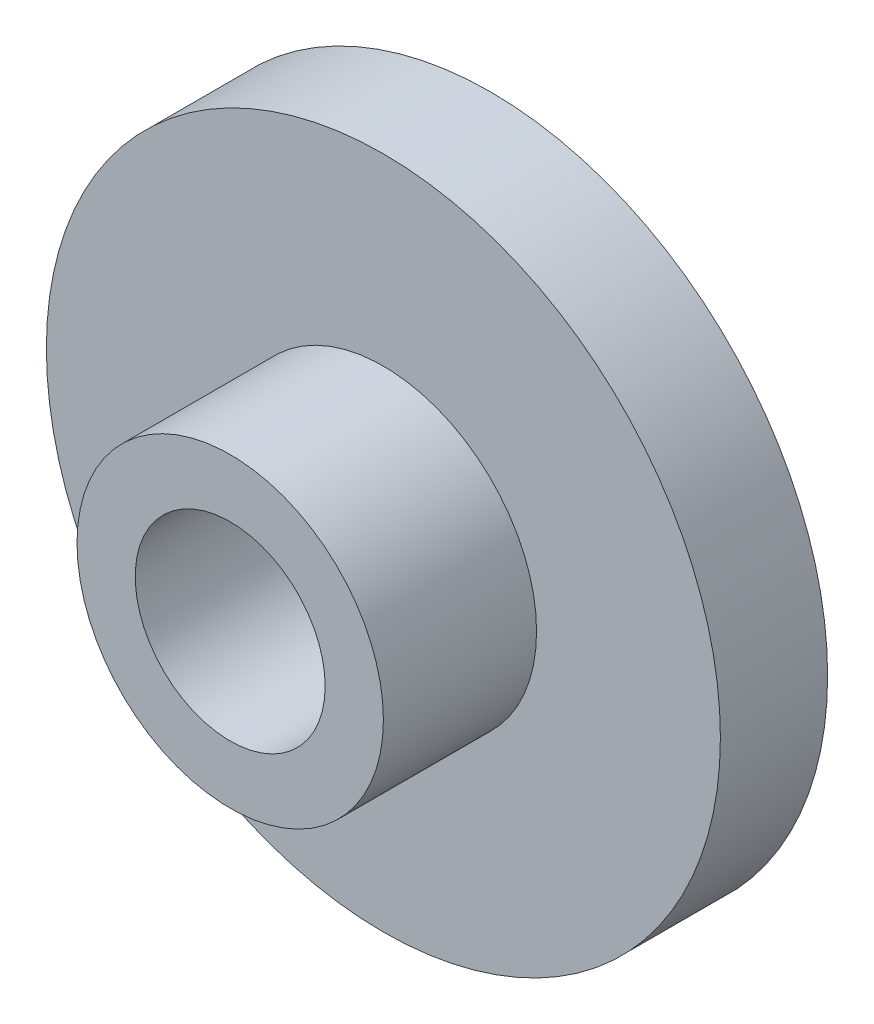
ISO-10303-21;
HEADER;
FILE_DESCRIPTION(('STEP AP214'),'2;1');
FILE_NAME('part.step','',(''),(''),'','','');
FILE_SCHEMA(('AUTOMOTIVE_DESIGN { 1 0 10303 214 1 1 1 1 }'));
ENDSEC;
DATA;
#1=APPLICATION_CONTEXT('core data for automotive mechanical design processes');
#2=APPLICATION_PROTOCOL_DEFINITION('international standard','automotive_design',2000,#1);
#3=PRODUCT_CONTEXT('',#1,'mechanical');
#4=PRODUCT('Part','Part','',(#3));
#5=PRODUCT_RELATED_PRODUCT_CATEGORY('part','',(#4));
#6=PRODUCT_DEFINITION_FORMATION('','',#4);
#7=PRODUCT_DEFINITION_CONTEXT('part definition',#1,'design');
#8=PRODUCT_DEFINITION('design','',#6,#7);
#9=PRODUCT_DEFINITION_SHAPE('','',#8);
#10=(LENGTH_UNIT() NAMED_UNIT(*) SI_UNIT(.MILLI.,.METRE.));
#11=(NAMED_UNIT(*) PLANE_ANGLE_UNIT() SI_UNIT($,.RADIAN.));
#12=(NAMED_UNIT(*) SI_UNIT($,.STERADIAN.) SOLID_ANGLE_UNIT());
#13=UNCERTAINTY_MEASURE_WITH_UNIT(LENGTH_MEASURE(1.E-05),#10,'distance_accuracy_value','');
#14=(GEOMETRIC_REPRESENTATION_CONTEXT(3) GLOBAL_UNCERTAINTY_ASSIGNED_CONTEXT((#13)) GLOBAL_UNIT_ASSIGNED_CONTEXT((#10,
#11,#12)) REPRESENTATION_CONTEXT('',''));
#15=CARTESIAN_POINT('',(0.,0.,0.));
#16=DIRECTION('',(0.,0.,1.));
#17=DIRECTION('',(1.,0.,0.));
#18=AXIS2_PLACEMENT_3D('',#15,#16,#17);
#19=CARTESIAN_POINT('',(0.,0.,3.5));
#20=DIRECTION('',(0.,0.,1.));
#21=DIRECTION('',(1.,0.,0.));
#22=AXIS2_PLACEMENT_3D('',#19,#20,#21);
#23=PLANE('',#22);
#24=CARTESIAN_POINT('',(0.,0.,3.5));
#25=DIRECTION('',(0.,0.,1.));
#26=DIRECTION('',(1.,0.,0.));
#27=AXIS2_PLACEMENT_3D('',#24,#25,#26);
#28=CIRCLE('',#27,11.);
#29=CARTESIAN_POINT('',(11.,0.,3.5));
#30=VERTEX_POINT('',#29);
#31=EDGE_CURVE('E10',#30,#30,#28,.T.);
#32=ORIENTED_EDGE('',*,*,#31,.T.);
#33=EDGE_LOOP('',(#32));
#34=FACE_BOUND('',#33,.T.);
#35=CARTESIAN_POINT('',(0.,0.,3.5));
#36=DIRECTION('',(0.,0.,1.));
#37=DIRECTION('',(1.,0.,0.));
#38=AXIS2_PLACEMENT_3D('',#35,#36,#37);
#39=CIRCLE('',#38,5.);
#40=CARTESIAN_POINT('',(5.,0.,3.5));
#41=VERTEX_POINT('',#40);
#42=EDGE_CURVE('E46',#41,#41,#39,.T.);
#43=ORIENTED_EDGE('',*,*,#42,.F.);
#44=EDGE_LOOP('',(#43));
#45=FACE_BOUND('',#44,.T.);
#46=ADVANCED_FACE('F33',(#34,#45),#23,.T.);
#47=CARTESIAN_POINT('',(0.,0.,3.5));
#48=DIRECTION('',(0.,0.,-1.));
#49=DIRECTION('',(-1.,0.,0.));
#50=AXIS2_PLACEMENT_3D('',#47,#48,#49);
#51=CYLINDRICAL_SURFACE('',#50,11.);
#52=ORIENTED_EDGE('',*,*,#31,.F.);
#53=EDGE_LOOP('',(#52));
#54=FACE_BOUND('',#53,.T.);
#55=CARTESIAN_POINT('',(0.,0.,0.));
#56=DIRECTION('',(0.,0.,1.));
#57=DIRECTION('',(1.,0.,0.));
#58=AXIS2_PLACEMENT_3D('',#55,#56,#57);
#59=CIRCLE('',#58,11.);
#60=CARTESIAN_POINT('',(11.,0.,0.));
#61=VERTEX_POINT('',#60);
#62=EDGE_CURVE('E37',#61,#61,#59,.T.);
#63=ORIENTED_EDGE('',*,*,#62,.T.);
#64=EDGE_LOOP('',(#63));
#65=FACE_BOUND('',#64,.T.);
#66=ADVANCED_FACE('F35',(#54,#65),#51,.T.);
#67=CARTESIAN_POINT('',(0.,0.,0.));
#68=DIRECTION('',(0.,0.,1.));
#69=DIRECTION('',(1.,0.,0.));
#70=AXIS2_PLACEMENT_3D('',#67,#68,#69);
#71=PLANE('',#70);
#72=CARTESIAN_POINT('',(0.,0.,0.));
#73=DIRECTION('',(0.,0.,1.));
#74=DIRECTION('',(1.,0.,0.));
#75=AXIS2_PLACEMENT_3D('',#72,#73,#74);
#76=CIRCLE('',#75,3.1);
#77=CARTESIAN_POINT('',(3.1,0.,0.));
#78=VERTEX_POINT('',#77);
#79=EDGE_CURVE('E49',#78,#78,#76,.T.);
#80=ORIENTED_EDGE('',*,*,#79,.T.);
#81=EDGE_LOOP('',(#80));
#82=FACE_BOUND('',#81,.T.);
#83=ORIENTED_EDGE('',*,*,#62,.F.);
#84=EDGE_LOOP('',(#83));
#85=FACE_BOUND('',#84,.T.);
#86=ADVANCED_FACE('F58',(#82,#85),#71,.F.);
#87=CARTESIAN_POINT('',(0.,0.,8.5));
#88=DIRECTION('',(0.,0.,-1.));
#89=DIRECTION('',(-1.,0.,0.));
#90=AXIS2_PLACEMENT_3D('',#87,#88,#89);
#91=CYLINDRICAL_SURFACE('',#90,5.);
#92=CARTESIAN_POINT('',(0.,0.,8.5));
#93=DIRECTION('',(0.,0.,1.));
#94=DIRECTION('',(1.,0.,0.));
#95=AXIS2_PLACEMENT_3D('',#92,#93,#94);
#96=CIRCLE('',#95,5.);
#97=CARTESIAN_POINT('',(5.,0.,8.5));
#98=VERTEX_POINT('',#97);
#99=EDGE_CURVE('E44',#98,#98,#96,.T.);
#100=ORIENTED_EDGE('',*,*,#99,.F.);
#101=EDGE_LOOP('',(#100));
#102=FACE_BOUND('',#101,.T.);
#103=ORIENTED_EDGE('',*,*,#42,.T.);
#104=EDGE_LOOP('',(#103));
#105=FACE_BOUND('',#104,.T.);
#106=ADVANCED_FACE('F70',(#102,#105),#91,.T.);
#107=CARTESIAN_POINT('',(0.,0.,8.5));
#108=DIRECTION('',(0.,0.,1.));
#109=DIRECTION('',(1.,0.,0.));
#110=AXIS2_PLACEMENT_3D('',#107,#108,#109);
#111=PLANE('',#110);
#112=CARTESIAN_POINT('',(0.,0.,8.5));
#113=DIRECTION('',(0.,0.,1.));
#114=DIRECTION('',(1.,0.,0.));
#115=AXIS2_PLACEMENT_3D('',#112,#113,#114);
#116=CIRCLE('',#115,3.1);
#117=CARTESIAN_POINT('',(3.1,0.,8.5));
#118=VERTEX_POINT('',#117);
#119=EDGE_CURVE('E52',#118,#118,#116,.T.);
#120=ORIENTED_EDGE('',*,*,#119,.F.);
#121=EDGE_LOOP('',(#120));
#122=FACE_BOUND('',#121,.T.);
#123=ORIENTED_EDGE('',*,*,#99,.T.);
#124=EDGE_LOOP('',(#123));
#125=FACE_BOUND('',#124,.T.);
#126=ADVANCED_FACE('F64',(#122,#125),#111,.T.);
#127=CARTESIAN_POINT('',(0.,0.,0.));
#128=DIRECTION('',(0.,0.,1.));
#129=DIRECTION('',(1.,0.,0.));
#130=AXIS2_PLACEMENT_3D('',#127,#128,#129);
#131=CYLINDRICAL_SURFACE('',#130,3.1);
#132=ORIENTED_EDGE('',*,*,#79,.F.);
#133=EDGE_LOOP('',(#132));
#134=FACE_BOUND('',#133,.T.);
#135=ORIENTED_EDGE('',*,*,#119,.T.);
#136=EDGE_LOOP('',(#135));
#137=FACE_BOUND('',#136,.T.);
#138=ADVANCED_FACE('F61',(#134,#137),#131,.F.);
#139=CLOSED_SHELL('',(#46,#66,#86,#106,#126,#138));
#140=MANIFOLD_SOLID_BREP('B2',#139);
#141=ADVANCED_BREP_SHAPE_REPRESENTATION('',(#18,#140),#14);
#142=SHAPE_DEFINITION_REPRESENTATION(#9,#141);
ENDSEC;
END-ISO-10303-21;
